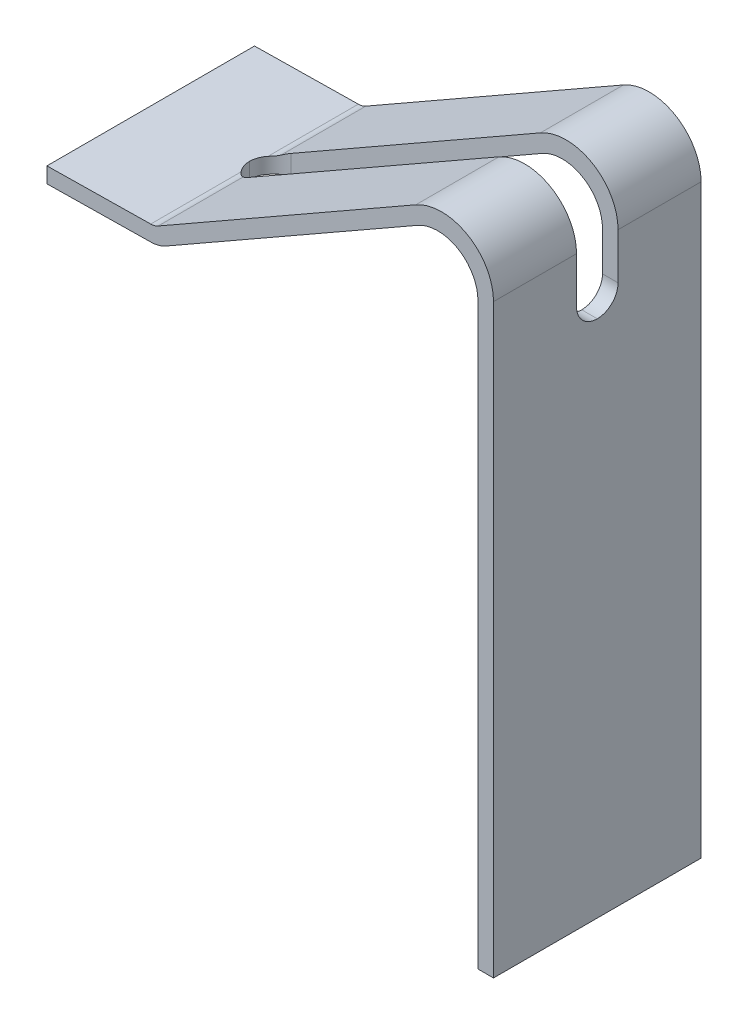
ISO-10303-21;
HEADER;
FILE_DESCRIPTION(('STEP AP214'),'2;1');
FILE_NAME('part.step','',(''),(''),'','','');
FILE_SCHEMA(('AUTOMOTIVE_DESIGN { 1 0 10303 214 1 1 1 1 }'));
ENDSEC;
DATA;
#1=APPLICATION_CONTEXT('core data for automotive mechanical design processes');
#2=APPLICATION_PROTOCOL_DEFINITION('international standard','automotive_design',2000,#1);
#3=PRODUCT_CONTEXT('',#1,'mechanical');
#4=PRODUCT('Part','Part','',(#3));
#5=PRODUCT_RELATED_PRODUCT_CATEGORY('part','',(#4));
#6=PRODUCT_DEFINITION_FORMATION('','',#4);
#7=PRODUCT_DEFINITION_CONTEXT('part definition',#1,'design');
#8=PRODUCT_DEFINITION('design','',#6,#7);
#9=PRODUCT_DEFINITION_SHAPE('','',#8);
#10=(LENGTH_UNIT() NAMED_UNIT(*) SI_UNIT(.MILLI.,.METRE.));
#11=(NAMED_UNIT(*) PLANE_ANGLE_UNIT() SI_UNIT($,.RADIAN.));
#12=(NAMED_UNIT(*) SI_UNIT($,.STERADIAN.) SOLID_ANGLE_UNIT());
#13=UNCERTAINTY_MEASURE_WITH_UNIT(LENGTH_MEASURE(1.E-05),#10,'distance_accuracy_value','');
#14=(GEOMETRIC_REPRESENTATION_CONTEXT(3) GLOBAL_UNCERTAINTY_ASSIGNED_CONTEXT((#13)) GLOBAL_UNIT_ASSIGNED_CONTEXT((#10,
#11,#12)) REPRESENTATION_CONTEXT('',''));
#15=CARTESIAN_POINT('',(0.,0.,0.));
#16=DIRECTION('',(0.,0.,1.));
#17=DIRECTION('',(1.,0.,0.));
#18=AXIS2_PLACEMENT_3D('',#15,#16,#17);
#19=CARTESIAN_POINT('',(1.07938838039175,10.209972433005,2.));
#20=DIRECTION('',(0.,0.,-1.));
#21=DIRECTION('',(-1.,0.,0.));
#22=AXIS2_PLACEMENT_3D('',#19,#20,#21);
#23=CYLINDRICAL_SURFACE('',#22,1.);
#24=CARTESIAN_POINT('',(1.07938838039175,10.209972433005,-0.4));
#25=DIRECTION('',(0.,0.,-1.));
#26=DIRECTION('',(-1.,0.,0.));
#27=AXIS2_PLACEMENT_3D('',#24,#25,#26);
#28=CIRCLE('',#27,1.);
#29=CARTESIAN_POINT('',(0.583337044187871,11.0782656276406,-0.4));
#30=VERTEX_POINT('',#29);
#31=CARTESIAN_POINT('',(2.07938838039175,10.209972433005,-0.4));
#32=VERTEX_POINT('',#31);
#33=EDGE_CURVE('E394',#30,#32,#28,.T.);
#34=ORIENTED_EDGE('',*,*,#33,.T.);
#35=DIRECTION('',(0.,0.,-1.));
#36=VECTOR('',#35,1.);
#37=CARTESIAN_POINT('',(2.07938838039175,10.209972433005,2.));
#38=LINE('',#37,#36);
#39=CARTESIAN_POINT('',(2.07938838039175,10.209972433005,-2.));
#40=VERTEX_POINT('',#39);
#41=EDGE_CURVE('E270',#32,#40,#38,.T.);
#42=ORIENTED_EDGE('',*,*,#41,.T.);
#43=CARTESIAN_POINT('',(1.07938838039175,10.209972433005,-2.));
#44=DIRECTION('',(0.,0.,1.));
#45=DIRECTION('',(1.,0.,0.));
#46=AXIS2_PLACEMENT_3D('',#43,#44,#45);
#47=CIRCLE('',#46,1.);
#48=CARTESIAN_POINT('',(0.583337044187871,11.0782656276406,-2.));
#49=VERTEX_POINT('',#48);
#50=EDGE_CURVE('E433',#40,#49,#47,.T.);
#51=ORIENTED_EDGE('',*,*,#50,.T.);
#52=DIRECTION('',(0.,0.,-1.));
#53=VECTOR('',#52,1.);
#54=CARTESIAN_POINT('',(0.583337044187871,11.0782656276406,2.));
#55=LINE('',#54,#53);
#56=EDGE_CURVE('E266',#30,#49,#55,.T.);
#57=ORIENTED_EDGE('',*,*,#56,.F.);
#58=EDGE_LOOP('',(#34,#42,#51,#57));
#59=FACE_BOUND('',#58,.T.);
#60=ADVANCED_FACE('F37',(#59),#23,.T.);
#61=CARTESIAN_POINT('',(1.00409281300757,10.0802397172688,2.));
#62=DIRECTION('',(0.,0.,-1.));
#63=DIRECTION('',(-1.,0.,0.));
#64=AXIS2_PLACEMENT_3D('',#61,#62,#63);
#65=CYLINDRICAL_SURFACE('',#64,0.775295567384185);
#66=DIRECTION('',(0.,0.,-1.));
#67=VECTOR('',#66,1.);
#68=CARTESIAN_POINT('',(1.77938838039175,10.0802397172688,2.));
#69=LINE('',#68,#67);
#70=CARTESIAN_POINT('',(1.77938838039175,10.0802397172688,-0.4));
#71=VERTEX_POINT('',#70);
#72=CARTESIAN_POINT('',(1.77938838039175,10.0802397172688,-2.));
#73=VERTEX_POINT('',#72);
#74=EDGE_CURVE('E234',#71,#73,#69,.T.);
#75=ORIENTED_EDGE('',*,*,#74,.F.);
#76=CARTESIAN_POINT('',(1.00409281300757,10.0802397172688,-0.4));
#77=DIRECTION('',(0.,0.,-1.));
#78=DIRECTION('',(-1.,0.,0.));
#79=AXIS2_PLACEMENT_3D('',#76,#77,#78);
#80=CIRCLE('',#79,0.775295567384185);
#81=CARTESIAN_POINT('',(0.619506410853697,10.7534235822596,-0.4));
#82=VERTEX_POINT('',#81);
#83=EDGE_CURVE('E219',#71,#82,#80,.F.);
#84=ORIENTED_EDGE('',*,*,#83,.T.);
#85=DIRECTION('',(0.,0.,-1.));
#86=VECTOR('',#85,1.);
#87=CARTESIAN_POINT('',(0.619506410853697,10.7534235822596,2.));
#88=LINE('',#87,#86);
#89=CARTESIAN_POINT('',(0.619506410853697,10.7534235822596,-2.));
#90=VERTEX_POINT('',#89);
#91=EDGE_CURVE('E232',#82,#90,#88,.T.);
#92=ORIENTED_EDGE('',*,*,#91,.T.);
#93=CARTESIAN_POINT('',(1.00409281300757,10.0802397172688,-2.));
#94=DIRECTION('',(0.,0.,-1.));
#95=DIRECTION('',(1.,0.,0.));
#96=AXIS2_PLACEMENT_3D('',#93,#94,#95);
#97=CIRCLE('',#96,0.775295567384185);
#98=EDGE_CURVE('E404',#90,#73,#97,.T.);
#99=ORIENTED_EDGE('',*,*,#98,.T.);
#100=EDGE_LOOP('',(#75,#84,#92,#99));
#101=FACE_BOUND('',#100,.T.);
#102=ADVANCED_FACE('F230',(#101),#65,.F.);
#103=CARTESIAN_POINT('',(2.07938838039175,10.209972433005,2.));
#104=VERTEX_POINT('',#103);
#105=CARTESIAN_POINT('',(2.07938838039175,10.209972433005,0.4));
#106=VERTEX_POINT('',#105);
#107=EDGE_CURVE('E271',#104,#106,#38,.T.);
#108=ORIENTED_EDGE('',*,*,#107,.T.);
#109=CARTESIAN_POINT('',(1.07938838039175,10.209972433005,0.4));
#110=DIRECTION('',(0.,0.,-1.));
#111=DIRECTION('',(-1.,0.,0.));
#112=AXIS2_PLACEMENT_3D('',#109,#110,#111);
#113=CIRCLE('',#112,1.);
#114=CARTESIAN_POINT('',(0.583337044187871,11.0782656276406,0.4));
#115=VERTEX_POINT('',#114);
#116=EDGE_CURVE('E385',#115,#106,#113,.T.);
#117=ORIENTED_EDGE('',*,*,#116,.F.);
#118=CARTESIAN_POINT('',(0.583337044187871,11.0782656276406,2.));
#119=VERTEX_POINT('',#118);
#120=EDGE_CURVE('E267',#119,#115,#55,.T.);
#121=ORIENTED_EDGE('',*,*,#120,.F.);
#122=CARTESIAN_POINT('',(1.07938838039175,10.209972433005,2.));
#123=DIRECTION('',(0.,0.,1.));
#124=DIRECTION('',(1.,0.,0.));
#125=AXIS2_PLACEMENT_3D('',#122,#123,#124);
#126=CIRCLE('',#125,1.);
#127=EDGE_CURVE('E408',#104,#119,#126,.T.);
#128=ORIENTED_EDGE('',*,*,#127,.F.);
#129=EDGE_LOOP('',(#108,#117,#121,#128));
#130=FACE_BOUND('',#129,.T.);
#131=ADVANCED_FACE('F507',(#130),#23,.T.);
#132=CARTESIAN_POINT('',(0.58333704418787,11.0782656276406,2.));
#133=DIRECTION('',(0.496051336203883,-0.868293194635512,0.));
#134=DIRECTION('',(0.868293194635512,0.496051336203883,0.));
#135=AXIS2_PLACEMENT_3D('',#132,#133,#134);
#136=PLANE('',#135);
#137=DIRECTION('',(0.868293194635512,0.496051336203883,0.));
#138=VECTOR('',#137,1.);
#139=CARTESIAN_POINT('',(0.58333704418787,11.0782656276406,0.4));
#140=LINE('',#139,#138);
#141=CARTESIAN_POINT('',(-4.22061161960825,8.33379501742088,0.4));
#142=VERTEX_POINT('',#141);
#143=EDGE_CURVE('E396',#142,#115,#140,.T.);
#144=ORIENTED_EDGE('',*,*,#143,.F.);
#145=CARTESIAN_POINT('',(-4.22061161960825,8.33379501742088,0.));
#146=DIRECTION('',(0.496051336203883,-0.868293194635512,0.));
#147=DIRECTION('',(-0.868293194635512,-0.496051336203883,0.));
#148=AXIS2_PLACEMENT_3D('',#145,#146,#147);
#149=ELLIPSE('',#148,0.460673885815621,0.4);
#150=CARTESIAN_POINT('',(-4.38061108192166,8.24238816595316,0.366606290262111));
#151=VERTEX_POINT('',#150);
#152=EDGE_CURVE('E487',#142,#151,#149,.T.);
#153=ORIENTED_EDGE('',*,*,#152,.T.);
#154=DIRECTION('',(0.,0.,-1.));
#155=VECTOR('',#154,1.);
#156=CARTESIAN_POINT('',(-4.38061108192166,8.24238816595316,2.));
#157=LINE('',#156,#155);
#158=CARTESIAN_POINT('',(-4.38061108192166,8.24238816595316,2.));
#159=VERTEX_POINT('',#158);
#160=EDGE_CURVE('E264',#159,#151,#157,.T.);
#161=ORIENTED_EDGE('',*,*,#160,.F.);
#162=DIRECTION('',(-0.868293194635512,-0.496051336203883,0.));
#163=VECTOR('',#162,1.);
#164=CARTESIAN_POINT('',(0.58333704418787,11.0782656276406,2.));
#165=LINE('',#164,#163);
#166=EDGE_CURVE('E410',#119,#159,#165,.T.);
#167=ORIENTED_EDGE('',*,*,#166,.F.);
#168=ORIENTED_EDGE('',*,*,#120,.T.);
#169=EDGE_LOOP('',(#144,#153,#161,#167,#168));
#170=FACE_BOUND('',#169,.T.);
#171=ADVANCED_FACE('F502',(#170),#136,.F.);
#172=CARTESIAN_POINT('',(-4.52942648278283,8.50287612434381,2.));
#173=DIRECTION('',(0.,0.,-1.));
#174=DIRECTION('',(-1.,0.,0.));
#175=AXIS2_PLACEMENT_3D('',#172,#173,#174);
#176=CYLINDRICAL_SURFACE('',#175,0.299999999999998);
#177=ORIENTED_EDGE('',*,*,#160,.T.);
#178=CARTESIAN_POINT('',(-4.38061108192166,8.24238816595316,0.36660629026211));
#179=CARTESIAN_POINT('',(-4.39365838327271,8.23490580670511,0.360949740759069));
#180=CARTESIAN_POINT('',(-4.40692409467293,8.22865495489743,0.354296055724142));
#181=CARTESIAN_POINT('',(-4.43290879822453,8.21850032744044,0.339325512590039));
#182=CARTESIAN_POINT('',(-4.44563300225809,8.21453926724607,0.331056878673564));
#183=CARTESIAN_POINT('',(-4.46997033388543,8.20856423423468,0.313119815062712));
#184=CARTESIAN_POINT('',(-4.48160411765151,8.20650085016347,0.30349491772136));
#185=CARTESIAN_POINT('',(-4.50409665741563,8.20372739943339,0.282631798761902));
#186=CARTESIAN_POINT('',(-4.51492707746383,8.20305425285609,0.271357879478832));
#187=CARTESIAN_POINT('',(-4.52501905119554,8.20290850184631,0.25949203377836));
#188=B_SPLINE_CURVE_WITH_KNOTS('',3,(#178,#179,#180,#181,#182,#183,#184,#185,#186,#187),
.UNSPECIFIED.,.F.,.F.,(4,2,2,2,4),(0.,0.0480698623126395,0.0948783425544005,0.140430350415653,
0.187177278791692),.UNSPECIFIED.);
#189=CARTESIAN_POINT('',(-4.52501905119554,8.20290850184631,0.25949203377836));
#190=VERTEX_POINT('',#189);
#191=EDGE_CURVE('E481',#151,#190,#188,.T.);
#192=ORIENTED_EDGE('',*,*,#191,.T.);
#193=DIRECTION('',(0.,0.,-1.));
#194=VECTOR('',#193,1.);
#195=CARTESIAN_POINT('',(-4.52501905119554,8.20290850184631,2.));
#196=LINE('',#195,#194);
#197=CARTESIAN_POINT('',(-4.52501905119554,8.20290850184631,2.));
#198=VERTEX_POINT('',#197);
#199=EDGE_CURVE('E261',#198,#190,#196,.T.);
#200=ORIENTED_EDGE('',*,*,#199,.F.);
#201=CARTESIAN_POINT('',(-4.52942648278283,8.50287612434381,2.));
#202=DIRECTION('',(0.,0.,-1.));
#203=DIRECTION('',(1.,0.,0.));
#204=AXIS2_PLACEMENT_3D('',#201,#202,#203);
#205=CIRCLE('',#204,0.299999999999998);
#206=EDGE_CURVE('E412',#159,#198,#205,.T.);
#207=ORIENTED_EDGE('',*,*,#206,.F.);
#208=EDGE_LOOP('',(#177,#192,#200,#207));
#209=FACE_BOUND('',#208,.T.);
#210=ADVANCED_FACE('F498',(#209),#176,.F.);
#211=CARTESIAN_POINT('',(-6.52501905119554,8.17352245310816,2.));
#212=DIRECTION('',(0.014691438624301,-0.99989207499167,0.));
#213=DIRECTION('',(0.999892074991671,0.014691438624301,0.));
#214=AXIS2_PLACEMENT_3D('',#211,#212,#213);
#215=PLANE('',#214);
#216=ORIENTED_EDGE('',*,*,#199,.T.);
#217=CARTESIAN_POINT('',(-4.22061161960825,8.20738116765676,0.));
#218=DIRECTION('',(0.014691438624301,-0.99989207499167,0.));
#219=DIRECTION('',(-0.999892074991671,-0.014691438624301,0.));
#220=AXIS2_PLACEMENT_3D('',#217,#218,#219);
#221=ELLIPSE('',#220,0.400043174662958,0.4);
#222=CARTESIAN_POINT('',(-4.62061161960825,8.20150395790912,0.));
#223=VERTEX_POINT('',#222);
#224=EDGE_CURVE('E475',#190,#223,#221,.T.);
#225=ORIENTED_EDGE('',*,*,#224,.T.);
#226=CARTESIAN_POINT('',(-4.22061161960825,8.20738116765676,0.));
#227=DIRECTION('',(0.014691438624301,-0.99989207499167,0.));
#228=DIRECTION('',(0.999892074991671,0.014691438624301,0.));
#229=AXIS2_PLACEMENT_3D('',#226,#227,#228);
#230=ELLIPSE('',#229,0.400043174662958,0.4);
#231=CARTESIAN_POINT('',(-4.52501905119554,8.20290850184631,-0.25949203377836));
#232=VERTEX_POINT('',#231);
#233=EDGE_CURVE('E288',#223,#232,#230,.T.);
#234=ORIENTED_EDGE('',*,*,#233,.T.);
#235=CARTESIAN_POINT('',(-4.52501905119554,8.20290850184631,-2.));
#236=VERTEX_POINT('',#235);
#237=EDGE_CURVE('E260',#232,#236,#196,.T.);
#238=ORIENTED_EDGE('',*,*,#237,.T.);
#239=DIRECTION('',(-0.999892074991671,-0.014691438624301,0.));
#240=VECTOR('',#239,1.);
#241=CARTESIAN_POINT('',(-6.52501905119554,8.17352245310816,-2.));
#242=LINE('',#241,#240);
#243=CARTESIAN_POINT('',(-6.52501905119554,8.17352245310816,-2.));
#244=VERTEX_POINT('',#243);
#245=EDGE_CURVE('E442',#236,#244,#242,.T.);
#246=ORIENTED_EDGE('',*,*,#245,.T.);
#247=DIRECTION('',(0.,0.,-1.));
#248=VECTOR('',#247,1.);
#249=CARTESIAN_POINT('',(-6.52501905119554,8.17352245310816,2.));
#250=LINE('',#249,#248);
#251=CARTESIAN_POINT('',(-6.52501905119554,8.17352245310816,2.));
#252=VERTEX_POINT('',#251);
#253=EDGE_CURVE('E257',#252,#244,#250,.T.);
#254=ORIENTED_EDGE('',*,*,#253,.F.);
#255=DIRECTION('',(-0.999892074991671,-0.014691438624301,0.));
#256=VECTOR('',#255,1.);
#257=CARTESIAN_POINT('',(-6.52501905119554,8.17352245310816,2.));
#258=LINE('',#257,#256);
#259=EDGE_CURVE('E414',#198,#252,#258,.T.);
#260=ORIENTED_EDGE('',*,*,#259,.F.);
#261=EDGE_LOOP('',(#216,#225,#234,#238,#246,#254,#260));
#262=FACE_BOUND('',#261,.T.);
#263=ADVANCED_FACE('F473',(#262),#215,.F.);
#264=CARTESIAN_POINT('',(-4.52061161960825,7.90294087934881,2.));
#265=DIRECTION('',(-0.0146914386243002,0.99989207499167,0.));
#266=DIRECTION('',(-0.999892074991671,-0.0146914386243002,0.));
#267=AXIS2_PLACEMENT_3D('',#264,#265,#266);
#268=PLANE('',#267);
#269=CARTESIAN_POINT('',(-4.22061161960825,7.90734878665953,0.));
#270=DIRECTION('',(-0.0146914386243002,0.99989207499167,0.));
#271=DIRECTION('',(0.999892074991671,0.0146914386243002,0.));
#272=AXIS2_PLACEMENT_3D('',#269,#270,#271);
#273=ELLIPSE('',#272,0.400043174662958,0.4);
#274=CARTESIAN_POINT('',(-4.52061161960825,7.90294087934881,-0.264575131106459));
#275=VERTEX_POINT('',#274);
#276=CARTESIAN_POINT('',(-4.62061161960825,7.9014715769119,0.));
#277=VERTEX_POINT('',#276);
#278=EDGE_CURVE('E324',#275,#277,#273,.T.);
#279=ORIENTED_EDGE('',*,*,#278,.T.);
#280=CARTESIAN_POINT('',(-4.22061161960825,7.90734878665953,0.));
#281=DIRECTION('',(-0.0146914386243002,0.99989207499167,0.));
#282=DIRECTION('',(-0.999892074991671,-0.0146914386243002,0.));
#283=AXIS2_PLACEMENT_3D('',#280,#281,#282);
#284=ELLIPSE('',#283,0.400043174662958,0.4);
#285=CARTESIAN_POINT('',(-4.52061161960825,7.90294087934881,0.264575131106459));
#286=VERTEX_POINT('',#285);
#287=EDGE_CURVE('E347',#277,#286,#284,.T.);
#288=ORIENTED_EDGE('',*,*,#287,.T.);
#289=DIRECTION('',(0.,0.,-1.));
#290=VECTOR('',#289,1.);
#291=CARTESIAN_POINT('',(-4.52061161960825,7.90294087934881,2.));
#292=LINE('',#291,#290);
#293=CARTESIAN_POINT('',(-4.52061161960825,7.90294087934881,2.));
#294=VERTEX_POINT('',#293);
#295=EDGE_CURVE('E61',#294,#286,#292,.T.);
#296=ORIENTED_EDGE('',*,*,#295,.F.);
#297=DIRECTION('',(0.999892074991671,0.0146914386243002,0.));
#298=VECTOR('',#297,1.);
#299=CARTESIAN_POINT('',(-4.52061161960825,7.90294087934881,2.));
#300=LINE('',#299,#298);
#301=CARTESIAN_POINT('',(-6.52061161960825,7.87355483061066,2.));
#302=VERTEX_POINT('',#301);
#303=EDGE_CURVE('E418',#302,#294,#300,.T.);
#304=ORIENTED_EDGE('',*,*,#303,.F.);
#305=DIRECTION('',(0.,0.,-1.));
#306=VECTOR('',#305,1.);
#307=CARTESIAN_POINT('',(-6.52061161960825,7.87355483061066,2.));
#308=LINE('',#307,#306);
#309=CARTESIAN_POINT('',(-6.52061161960825,7.87355483061066,-2.));
#310=VERTEX_POINT('',#309);
#311=EDGE_CURVE('E254',#302,#310,#308,.T.);
#312=ORIENTED_EDGE('',*,*,#311,.T.);
#313=DIRECTION('',(0.999892074991671,0.0146914386243002,0.));
#314=VECTOR('',#313,1.);
#315=CARTESIAN_POINT('',(-4.52061161960825,7.90294087934881,-2.));
#316=LINE('',#315,#314);
#317=CARTESIAN_POINT('',(-4.52061161960825,7.90294087934881,-2.));
#318=VERTEX_POINT('',#317);
#319=EDGE_CURVE('E446',#310,#318,#316,.T.);
#320=ORIENTED_EDGE('',*,*,#319,.T.);
#321=EDGE_CURVE('E252',#275,#318,#292,.T.);
#322=ORIENTED_EDGE('',*,*,#321,.F.);
#323=EDGE_LOOP('',(#279,#288,#296,#304,#312,#320,#322));
#324=FACE_BOUND('',#323,.T.);
#325=ADVANCED_FACE('F336',(#324),#268,.F.);
#326=CARTESIAN_POINT('',(-4.52942648278283,8.50287612434382,2.));
#327=DIRECTION('',(0.,0.,-1.));
#328=DIRECTION('',(-1.,0.,0.));
#329=AXIS2_PLACEMENT_3D('',#326,#327,#328);
#330=CYLINDRICAL_SURFACE('',#329,0.600000000000002);
#331=ORIENTED_EDGE('',*,*,#295,.T.);
#332=CARTESIAN_POINT('',(-4.52061161960825,7.90294087934881,0.264575131106459));
#333=CARTESIAN_POINT('',(-4.50724401017289,7.90312587130588,0.279774268988246));
#334=CARTESIAN_POINT('',(-4.49267386747487,7.90379737028348,0.293932895122339));
#335=CARTESIAN_POINT('',(-4.461677026405,7.90651381756933,0.319826040420823));
#336=CARTESIAN_POINT('',(-4.44525347520852,7.9085564659452,0.331564575957396));
#337=CARTESIAN_POINT('',(-4.41098982788124,7.91442389896125,0.352364046113291));
#338=CARTESIAN_POINT('',(-4.39314494363604,7.91825493871002,0.361415398736344));
#339=CARTESIAN_POINT('',(-4.3567905930127,7.92794135067373,0.376620317173052));
#340=CARTESIAN_POINT('',(-4.3382814709275,7.93379568735995,0.382775361526815));
#341=CARTESIAN_POINT('',(-4.30488695471764,7.94624752657733,0.391325025360888));
#342=CARTESIAN_POINT('',(-4.28998951791501,7.95248533270155,0.394215303176958));
#343=CARTESIAN_POINT('',(-4.26054736511084,7.96624586564557,0.398281087322699));
#344=CARTESIAN_POINT('',(-4.24600281740065,7.97376919228548,0.399455790716472));
#345=CARTESIAN_POINT('',(-4.2317956810605,7.98190020756251,0.399843615391608));
#346=B_SPLINE_CURVE_WITH_KNOTS('',3,(#332,#333,#334,#335,#336,#337,#338,#339,#340,#341,#342,
#343,#344,#345),.UNSPECIFIED.,.F.,.F.,(4,2,2,2,2,2,4),(0.,0.0606903021900377,0.121279057497597,
0.182081335365354,0.242852540436971,0.291931429185142,0.341033280846589),.UNSPECIFIED.);
#347=CARTESIAN_POINT('',(-4.2317956810605,7.98190020756251,0.399843615391608));
#348=VERTEX_POINT('',#347);
#349=EDGE_CURVE('E340',#286,#348,#346,.T.);
#350=ORIENTED_EDGE('',*,*,#349,.T.);
#351=DIRECTION('',(0.,0.,-1.));
#352=VECTOR('',#351,1.);
#353=CARTESIAN_POINT('',(-4.2317956810605,7.98190020756251,2.));
#354=LINE('',#353,#352);
#355=CARTESIAN_POINT('',(-4.2317956810605,7.98190020756251,2.));
#356=VERTEX_POINT('',#355);
#357=EDGE_CURVE('E54',#356,#348,#354,.T.);
#358=ORIENTED_EDGE('',*,*,#357,.F.);
#359=CARTESIAN_POINT('',(-4.52942648278283,8.50287612434382,2.));
#360=DIRECTION('',(0.,0.,1.));
#361=DIRECTION('',(1.,0.,0.));
#362=AXIS2_PLACEMENT_3D('',#359,#360,#361);
#363=CIRCLE('',#362,0.600000000000002);
#364=EDGE_CURVE('E420',#294,#356,#363,.T.);
#365=ORIENTED_EDGE('',*,*,#364,.F.);
#366=EDGE_LOOP('',(#331,#350,#358,#365));
#367=FACE_BOUND('',#366,.T.);
#368=ADVANCED_FACE('F334',(#367),#330,.T.);
#369=CARTESIAN_POINT('',(0.619506410853697,10.7534235822596,2.));
#370=DIRECTION('',(-0.496051336203883,0.868293194635511,0.));
#371=DIRECTION('',(-0.868293194635511,-0.496051336203883,0.));
#372=AXIS2_PLACEMENT_3D('',#369,#370,#371);
#373=PLANE('',#372);
#374=ORIENTED_EDGE('',*,*,#357,.T.);
#375=CARTESIAN_POINT('',(-4.22061161960825,7.98828960305916,0.));
#376=DIRECTION('',(-0.496051336203883,0.868293194635511,0.));
#377=DIRECTION('',(-0.868293194635511,-0.496051336203883,0.));
#378=AXIS2_PLACEMENT_3D('',#375,#376,#377);
#379=ELLIPSE('',#378,0.460673885815621,0.4);
#380=CARTESIAN_POINT('',(-4.22061161960825,7.98828960305916,0.4));
#381=VERTEX_POINT('',#380);
#382=EDGE_CURVE('E346',#348,#381,#379,.T.);
#383=ORIENTED_EDGE('',*,*,#382,.T.);
#384=DIRECTION('',(0.868293194635511,0.496051336203883,0.));
#385=VECTOR('',#384,1.);
#386=CARTESIAN_POINT('',(-3.43938625113844,8.43459954801789,0.4));
#387=LINE('',#386,#385);
#388=CARTESIAN_POINT('',(0.619506410853697,10.7534235822596,0.4));
#389=VERTEX_POINT('',#388);
#390=EDGE_CURVE('E227',#381,#389,#387,.T.);
#391=ORIENTED_EDGE('',*,*,#390,.T.);
#392=CARTESIAN_POINT('',(0.619506410853697,10.7534235822596,2.));
#393=VERTEX_POINT('',#392);
#394=EDGE_CURVE('E242',#393,#389,#88,.T.);
#395=ORIENTED_EDGE('',*,*,#394,.F.);
#396=DIRECTION('',(0.868293194635511,0.496051336203883,0.));
#397=VECTOR('',#396,1.);
#398=CARTESIAN_POINT('',(0.619506410853697,10.7534235822596,2.));
#399=LINE('',#398,#397);
#400=EDGE_CURVE('E422',#356,#393,#399,.T.);
#401=ORIENTED_EDGE('',*,*,#400,.F.);
#402=EDGE_LOOP('',(#374,#383,#391,#395,#401));
#403=FACE_BOUND('',#402,.T.);
#404=ADVANCED_FACE('F520',(#403),#373,.F.);
#405=CARTESIAN_POINT('',(1.77938838039175,-1.07588472414067,2.));
#406=DIRECTION('',(1.,0.,0.));
#407=DIRECTION('',(0.,1.,0.));
#408=AXIS2_PLACEMENT_3D('',#405,#406,#407);
#409=PLANE('',#408);
#410=DIRECTION('',(0.,-1.,0.));
#411=VECTOR('',#410,1.);
#412=CARTESIAN_POINT('',(1.77938838039175,-1.07588472414067,0.4));
#413=LINE('',#412,#411);
#414=CARTESIAN_POINT('',(1.77938838039175,10.0802397172688,0.4));
#415=VERTEX_POINT('',#414);
#416=CARTESIAN_POINT('',(1.77938838039175,9.32411527585933,0.4));
#417=VERTEX_POINT('',#416);
#418=EDGE_CURVE('E361',#415,#417,#413,.T.);
#419=ORIENTED_EDGE('',*,*,#418,.T.);
#420=CARTESIAN_POINT('',(1.77938838039175,9.32411527585933,0.));
#421=DIRECTION('',(1.,0.,0.));
#422=DIRECTION('',(0.,1.,0.));
#423=AXIS2_PLACEMENT_3D('',#420,#421,#422);
#424=CIRCLE('',#423,0.4);
#425=CARTESIAN_POINT('',(1.77938838039175,8.92411527585933,0.));
#426=VERTEX_POINT('',#425);
#427=EDGE_CURVE('E46',#417,#426,#424,.T.);
#428=ORIENTED_EDGE('',*,*,#427,.T.);
#429=CARTESIAN_POINT('',(1.77938838039175,9.32411527585933,0.));
#430=DIRECTION('',(1.,0.,0.));
#431=DIRECTION('',(0.,1.,0.));
#432=AXIS2_PLACEMENT_3D('',#429,#430,#431);
#433=CIRCLE('',#432,0.4);
#434=CARTESIAN_POINT('',(1.77938838039175,9.32411527585933,-0.4));
#435=VERTEX_POINT('',#434);
#436=EDGE_CURVE('E352',#426,#435,#433,.T.);
#437=ORIENTED_EDGE('',*,*,#436,.T.);
#438=DIRECTION('',(0.,1.,0.));
#439=VECTOR('',#438,1.);
#440=CARTESIAN_POINT('',(1.77938838039175,-1.07588472414067,-0.4));
#441=LINE('',#440,#439);
#442=EDGE_CURVE('E235',#435,#71,#441,.T.);
#443=ORIENTED_EDGE('',*,*,#442,.T.);
#444=ORIENTED_EDGE('',*,*,#74,.T.);
#445=DIRECTION('',(0.,-1.,0.));
#446=VECTOR('',#445,1.);
#447=CARTESIAN_POINT('',(1.77938838039175,-1.07588472414067,-2.));
#448=LINE('',#447,#446);
#449=CARTESIAN_POINT('',(1.77938838039175,-1.07588472414067,-2.));
#450=VERTEX_POINT('',#449);
#451=EDGE_CURVE('E399',#73,#450,#448,.T.);
#452=ORIENTED_EDGE('',*,*,#451,.T.);
#453=DIRECTION('',(0.,0.,-1.));
#454=VECTOR('',#453,1.);
#455=CARTESIAN_POINT('',(1.77938838039175,-1.07588472414067,2.));
#456=LINE('',#455,#454);
#457=CARTESIAN_POINT('',(1.77938838039175,-1.07588472414067,2.));
#458=VERTEX_POINT('',#457);
#459=EDGE_CURVE('E277',#458,#450,#456,.T.);
#460=ORIENTED_EDGE('',*,*,#459,.F.);
#461=DIRECTION('',(0.,-1.,0.));
#462=VECTOR('',#461,1.);
#463=CARTESIAN_POINT('',(1.77938838039175,-1.07588472414067,2.));
#464=LINE('',#463,#462);
#465=CARTESIAN_POINT('',(1.77938838039175,10.0802397172688,2.));
#466=VERTEX_POINT('',#465);
#467=EDGE_CURVE('E400',#466,#458,#464,.T.);
#468=ORIENTED_EDGE('',*,*,#467,.F.);
#469=EDGE_CURVE('E243',#466,#415,#69,.T.);
#470=ORIENTED_EDGE('',*,*,#469,.T.);
#471=EDGE_LOOP('',(#419,#428,#437,#443,#444,#452,#460,#468,#470));
#472=FACE_BOUND('',#471,.T.);
#473=ADVANCED_FACE('F312',(#472),#409,.F.);
#474=CARTESIAN_POINT('',(1.77938838039175,-1.07588472414067,2.));
#475=DIRECTION('',(0.,1.,0.));
#476=DIRECTION('',(0.,0.,1.));
#477=AXIS2_PLACEMENT_3D('',#474,#475,#476);
#478=PLANE('',#477);
#479=DIRECTION('',(1.,0.,0.));
#480=VECTOR('',#479,1.);
#481=CARTESIAN_POINT('',(1.77938838039175,-1.07588472414067,-2.));
#482=LINE('',#481,#480);
#483=CARTESIAN_POINT('',(2.07938838039175,-1.07588472414067,-2.));
#484=VERTEX_POINT('',#483);
#485=EDGE_CURVE('E428',#450,#484,#482,.T.);
#486=ORIENTED_EDGE('',*,*,#485,.T.);
#487=DIRECTION('',(0.,0.,-1.));
#488=VECTOR('',#487,1.);
#489=CARTESIAN_POINT('',(2.07938838039175,-1.07588472414067,2.));
#490=LINE('',#489,#488);
#491=CARTESIAN_POINT('',(2.07938838039175,-1.07588472414067,2.));
#492=VERTEX_POINT('',#491);
#493=EDGE_CURVE('E274',#492,#484,#490,.T.);
#494=ORIENTED_EDGE('',*,*,#493,.F.);
#495=DIRECTION('',(1.,0.,0.));
#496=VECTOR('',#495,1.);
#497=CARTESIAN_POINT('',(1.77938838039175,-1.07588472414067,2.));
#498=LINE('',#497,#496);
#499=EDGE_CURVE('E403',#458,#492,#498,.T.);
#500=ORIENTED_EDGE('',*,*,#499,.F.);
#501=ORIENTED_EDGE('',*,*,#459,.T.);
#502=EDGE_LOOP('',(#486,#494,#500,#501));
#503=FACE_BOUND('',#502,.T.);
#504=ADVANCED_FACE('F513',(#503),#478,.F.);
#505=CARTESIAN_POINT('',(2.07938838039175,-1.07588472414067,2.));
#506=DIRECTION('',(-1.,0.,0.));
#507=DIRECTION('',(0.,-1.,0.));
#508=AXIS2_PLACEMENT_3D('',#505,#506,#507);
#509=PLANE('',#508);
#510=ORIENTED_EDGE('',*,*,#41,.F.);
#511=DIRECTION('',(0.,-1.,0.));
#512=VECTOR('',#511,1.);
#513=CARTESIAN_POINT('',(2.07938838039175,-1.07588472414067,-0.4));
#514=LINE('',#513,#512);
#515=CARTESIAN_POINT('',(2.07938838039175,9.32411527585933,-0.4));
#516=VERTEX_POINT('',#515);
#517=EDGE_CURVE('E390',#32,#516,#514,.T.);
#518=ORIENTED_EDGE('',*,*,#517,.T.);
#519=CARTESIAN_POINT('',(2.07938838039175,9.32411527585933,0.));
#520=DIRECTION('',(-1.,0.,0.));
#521=DIRECTION('',(0.,-1.,0.));
#522=AXIS2_PLACEMENT_3D('',#519,#520,#521);
#523=CIRCLE('',#522,0.4);
#524=CARTESIAN_POINT('',(2.07938838039175,8.92411527585933,0.));
#525=VERTEX_POINT('',#524);
#526=EDGE_CURVE('E350',#516,#525,#523,.T.);
#527=ORIENTED_EDGE('',*,*,#526,.T.);
#528=CARTESIAN_POINT('',(2.07938838039175,9.32411527585933,0.));
#529=DIRECTION('',(-1.,0.,0.));
#530=DIRECTION('',(0.,-1.,0.));
#531=AXIS2_PLACEMENT_3D('',#528,#529,#530);
#532=CIRCLE('',#531,0.4);
#533=CARTESIAN_POINT('',(2.07938838039175,9.32411527585933,0.4));
#534=VERTEX_POINT('',#533);
#535=EDGE_CURVE('E12',#525,#534,#532,.T.);
#536=ORIENTED_EDGE('',*,*,#535,.T.);
#537=DIRECTION('',(0.,1.,0.));
#538=VECTOR('',#537,1.);
#539=CARTESIAN_POINT('',(2.07938838039175,-1.07588472414067,0.4));
#540=LINE('',#539,#538);
#541=EDGE_CURVE('E236',#534,#106,#540,.T.);
#542=ORIENTED_EDGE('',*,*,#541,.T.);
#543=ORIENTED_EDGE('',*,*,#107,.F.);
#544=DIRECTION('',(0.,1.,0.));
#545=VECTOR('',#544,1.);
#546=CARTESIAN_POINT('',(2.07938838039175,-1.07588472414067,2.));
#547=LINE('',#546,#545);
#548=EDGE_CURVE('E406',#492,#104,#547,.T.);
#549=ORIENTED_EDGE('',*,*,#548,.F.);
#550=ORIENTED_EDGE('',*,*,#493,.T.);
#551=DIRECTION('',(0.,1.,0.));
#552=VECTOR('',#551,1.);
#553=CARTESIAN_POINT('',(2.07938838039175,-1.07588472414067,-2.));
#554=LINE('',#553,#552);
#555=EDGE_CURVE('E430',#484,#40,#554,.T.);
#556=ORIENTED_EDGE('',*,*,#555,.T.);
#557=EDGE_LOOP('',(#510,#518,#527,#536,#542,#543,#549,#550,#556));
#558=FACE_BOUND('',#557,.T.);
#559=ADVANCED_FACE('F376',(#558),#509,.F.);
#560=CARTESIAN_POINT('',(-4.38061108192166,8.24238816595316,-0.366606290262111));
#561=VERTEX_POINT('',#560);
#562=CARTESIAN_POINT('',(-4.38061108192166,8.24238816595316,-2.));
#563=VERTEX_POINT('',#562);
#564=EDGE_CURVE('E263',#561,#563,#157,.T.);
#565=ORIENTED_EDGE('',*,*,#564,.F.);
#566=CARTESIAN_POINT('',(-4.22061161960825,8.33379501742088,0.));
#567=DIRECTION('',(0.496051336203883,-0.868293194635512,0.));
#568=DIRECTION('',(0.868293194635512,0.496051336203883,0.));
#569=AXIS2_PLACEMENT_3D('',#566,#567,#568);
#570=ELLIPSE('',#569,0.460673885815621,0.4);
#571=CARTESIAN_POINT('',(-4.22061161960825,8.33379501742088,-0.4));
#572=VERTEX_POINT('',#571);
#573=EDGE_CURVE('E299',#561,#572,#570,.T.);
#574=ORIENTED_EDGE('',*,*,#573,.T.);
#575=DIRECTION('',(0.868293194635512,0.496051336203883,0.));
#576=VECTOR('',#575,1.);
#577=CARTESIAN_POINT('',(0.58333704418787,11.0782656276406,-0.4));
#578=LINE('',#577,#576);
#579=EDGE_CURVE('E226',#572,#30,#578,.T.);
#580=ORIENTED_EDGE('',*,*,#579,.T.);
#581=ORIENTED_EDGE('',*,*,#56,.T.);
#582=DIRECTION('',(-0.868293194635512,-0.496051336203883,0.));
#583=VECTOR('',#582,1.);
#584=CARTESIAN_POINT('',(0.58333704418787,11.0782656276406,-2.));
#585=LINE('',#584,#583);
#586=EDGE_CURVE('E436',#49,#563,#585,.T.);
#587=ORIENTED_EDGE('',*,*,#586,.T.);
#588=EDGE_LOOP('',(#565,#574,#580,#581,#587));
#589=FACE_BOUND('',#588,.T.);
#590=ADVANCED_FACE('F469',(#589),#136,.F.);
#591=ORIENTED_EDGE('',*,*,#237,.F.);
#592=CARTESIAN_POINT('',(-4.52501905119554,8.20290850184631,-0.25949203377836));
#593=CARTESIAN_POINT('',(-4.51410351686689,8.20306105775775,-0.272340747320112));
#594=CARTESIAN_POINT('',(-4.50230468675011,8.20384005338817,-0.284494840582222));
#595=CARTESIAN_POINT('',(-4.47777048493706,8.20710616134359,-0.306808061291965));
#596=CARTESIAN_POINT('',(-4.46507031173621,8.20954513757058,-0.317013292076783));
#597=CARTESIAN_POINT('',(-4.4405134183643,8.21611086342353,-0.334426105004253));
#598=CARTESIAN_POINT('',(-4.42874541782399,8.21999279343513,-0.341848071817193));
#599=CARTESIAN_POINT('',(-4.40479377314781,8.22967136929165,-0.35535242955513));
#600=CARTESIAN_POINT('',(-4.39260709831608,8.23551351042872,-0.361396639049973));
#601=CARTESIAN_POINT('',(-4.38061108192144,8.24238816595329,-0.366606290261757));
#602=B_SPLINE_CURVE_WITH_KNOTS('',3,(#592,#593,#594,#595,#596,#597,#598,#599,#600,#601),
.UNSPECIFIED.,.F.,.F.,(4,2,2,2,4),(0.,0.0506107843394847,0.0998131898531315,0.14295672771925,
0.187180198179944),.UNSPECIFIED.);
#603=EDGE_CURVE('E291',#232,#561,#602,.T.);
#604=ORIENTED_EDGE('',*,*,#603,.T.);
#605=ORIENTED_EDGE('',*,*,#564,.T.);
#606=CARTESIAN_POINT('',(-4.52942648278283,8.50287612434381,-2.));
#607=DIRECTION('',(0.,0.,-1.));
#608=DIRECTION('',(1.,0.,0.));
#609=AXIS2_PLACEMENT_3D('',#606,#607,#608);
#610=CIRCLE('',#609,0.299999999999998);
#611=EDGE_CURVE('E439',#563,#236,#610,.T.);
#612=ORIENTED_EDGE('',*,*,#611,.T.);
#613=EDGE_LOOP('',(#591,#604,#605,#612));
#614=FACE_BOUND('',#613,.T.);
#615=ADVANCED_FACE('F301',(#614),#176,.F.);
#616=CARTESIAN_POINT('',(-6.52061161960825,7.87355483061066,2.));
#617=DIRECTION('',(0.99989207499167,0.0146914386242996,0.));
#618=DIRECTION('',(-0.0146914386242996,0.999892074991671,0.));
#619=AXIS2_PLACEMENT_3D('',#616,#617,#618);
#620=PLANE('',#619);
#621=DIRECTION('',(0.0146914386242996,-0.999892074991671,0.));
#622=VECTOR('',#621,1.);
#623=CARTESIAN_POINT('',(-6.52061161960825,7.87355483061066,-2.));
#624=LINE('',#623,#622);
#625=EDGE_CURVE('E444',#244,#310,#624,.T.);
#626=ORIENTED_EDGE('',*,*,#625,.T.);
#627=ORIENTED_EDGE('',*,*,#311,.F.);
#628=DIRECTION('',(0.0146914386242996,-0.999892074991671,0.));
#629=VECTOR('',#628,1.);
#630=CARTESIAN_POINT('',(-6.52061161960825,7.87355483061066,2.));
#631=LINE('',#630,#629);
#632=EDGE_CURVE('E416',#252,#302,#631,.T.);
#633=ORIENTED_EDGE('',*,*,#632,.F.);
#634=ORIENTED_EDGE('',*,*,#253,.T.);
#635=EDGE_LOOP('',(#626,#627,#633,#634));
#636=FACE_BOUND('',#635,.T.);
#637=ADVANCED_FACE('F332',(#636),#620,.F.);
#638=CARTESIAN_POINT('',(-4.2317956810605,7.98190020756251,-0.399843615391608));
#639=VERTEX_POINT('',#638);
#640=CARTESIAN_POINT('',(-4.2317956810605,7.98190020756251,-2.));
#641=VERTEX_POINT('',#640);
#642=EDGE_CURVE('E246',#639,#641,#354,.T.);
#643=ORIENTED_EDGE('',*,*,#642,.F.);
#644=CARTESIAN_POINT('',(-4.2317956810605,7.98190020756251,-0.399843615391608));
#645=CARTESIAN_POINT('',(-4.24930913428991,7.97185640178489,-0.399382656763358));
#646=CARTESIAN_POINT('',(-4.26736040018383,7.96275422536114,-0.397697426519877));
#647=CARTESIAN_POINT('',(-4.30385327794033,7.94654557180844,-0.391671001721523));
#648=CARTESIAN_POINT('',(-4.32229386434937,7.93943442034161,-0.387336105341976));
#649=CARTESIAN_POINT('',(-4.35903991385515,7.92724834399985,-0.375780492686255));
#650=CARTESIAN_POINT('',(-4.3773445803359,7.92218138704269,-0.368548698828386));
#651=CARTESIAN_POINT('',(-4.4130172697813,7.9139929373265,-0.351244487093006));
#652=CARTESIAN_POINT('',(-4.43038546072449,7.91087109459868,-0.341172580688103));
#653=CARTESIAN_POINT('',(-4.46045587738048,7.90669707376582,-0.320535354390268));
#654=CARTESIAN_POINT('',(-4.47342565729922,7.90536822310807,-0.310408944011658));
#655=CARTESIAN_POINT('',(-4.49806035217063,7.90356866178688,-0.288608079580743));
#656=CARTESIAN_POINT('',(-4.50972524278162,7.90309796712916,-0.276933596659252));
#657=CARTESIAN_POINT('',(-4.52061161960825,7.90294087934881,-0.26457513110646));
#658=B_SPLINE_CURVE_WITH_KNOTS('',3,(#644,#645,#646,#647,#648,#649,#650,#651,#652,#653,#654,
#655,#656,#657),.UNSPECIFIED.,.F.,.F.,(4,2,2,2,2,2,4),(0.,0.0605617703641716,0.120980144050114,
0.181631794194519,0.242272528620989,0.291652879141077,0.341034150658774),.UNSPECIFIED.);
#659=EDGE_CURVE('E317',#639,#275,#658,.T.);
#660=ORIENTED_EDGE('',*,*,#659,.T.);
#661=ORIENTED_EDGE('',*,*,#321,.T.);
#662=CARTESIAN_POINT('',(-4.52942648278283,8.50287612434382,-2.));
#663=DIRECTION('',(0.,0.,1.));
#664=DIRECTION('',(1.,0.,0.));
#665=AXIS2_PLACEMENT_3D('',#662,#663,#664);
#666=CIRCLE('',#665,0.600000000000002);
#667=EDGE_CURVE('E449',#318,#641,#666,.T.);
#668=ORIENTED_EDGE('',*,*,#667,.T.);
#669=EDGE_LOOP('',(#643,#660,#661,#668));
#670=FACE_BOUND('',#669,.T.);
#671=ADVANCED_FACE('F327',(#670),#330,.T.);
#672=ORIENTED_EDGE('',*,*,#91,.F.);
#673=DIRECTION('',(0.868293194635511,0.496051336203883,0.));
#674=VECTOR('',#673,1.);
#675=CARTESIAN_POINT('',(-3.43938625113844,8.43459954801789,-0.4));
#676=LINE('',#675,#674);
#677=CARTESIAN_POINT('',(-4.22061161960825,7.98828960305916,-0.4));
#678=VERTEX_POINT('',#677);
#679=EDGE_CURVE('E214',#678,#82,#676,.T.);
#680=ORIENTED_EDGE('',*,*,#679,.F.);
#681=CARTESIAN_POINT('',(-4.22061161960825,7.98828960305916,0.));
#682=DIRECTION('',(-0.496051336203883,0.868293194635511,0.));
#683=DIRECTION('',(0.868293194635511,0.496051336203883,0.));
#684=AXIS2_PLACEMENT_3D('',#681,#682,#683);
#685=ELLIPSE('',#684,0.460673885815621,0.4);
#686=EDGE_CURVE('E325',#678,#639,#685,.T.);
#687=ORIENTED_EDGE('',*,*,#686,.T.);
#688=ORIENTED_EDGE('',*,*,#642,.T.);
#689=DIRECTION('',(0.868293194635511,0.496051336203883,0.));
#690=VECTOR('',#689,1.);
#691=CARTESIAN_POINT('',(0.619506410853697,10.7534235822596,-2.));
#692=LINE('',#691,#690);
#693=EDGE_CURVE('E240',#641,#90,#692,.T.);
#694=ORIENTED_EDGE('',*,*,#693,.T.);
#695=EDGE_LOOP('',(#672,#680,#687,#688,#694));
#696=FACE_BOUND('',#695,.T.);
#697=ADVANCED_FACE('F238',(#696),#373,.F.);
#698=ORIENTED_EDGE('',*,*,#394,.T.);
#699=CARTESIAN_POINT('',(1.00409281300757,10.0802397172688,0.4));
#700=DIRECTION('',(0.,0.,1.));
#701=DIRECTION('',(1.,0.,0.));
#702=AXIS2_PLACEMENT_3D('',#699,#700,#701);
#703=CIRCLE('',#702,0.775295567384185);
#704=EDGE_CURVE('E356',#389,#415,#703,.F.);
#705=ORIENTED_EDGE('',*,*,#704,.T.);
#706=ORIENTED_EDGE('',*,*,#469,.F.);
#707=CARTESIAN_POINT('',(1.00409281300757,10.0802397172688,2.));
#708=DIRECTION('',(0.,0.,-1.));
#709=DIRECTION('',(1.,0.,0.));
#710=AXIS2_PLACEMENT_3D('',#707,#708,#709);
#711=CIRCLE('',#710,0.775295567384185);
#712=EDGE_CURVE('E424',#393,#466,#711,.T.);
#713=ORIENTED_EDGE('',*,*,#712,.F.);
#714=EDGE_LOOP('',(#698,#705,#706,#713));
#715=FACE_BOUND('',#714,.T.);
#716=ADVANCED_FACE('F526',(#715),#65,.F.);
#717=CARTESIAN_POINT('',(1.00409281300757,10.0802397172688,2.));
#718=DIRECTION('',(0.,0.,1.));
#719=DIRECTION('',(1.,0.,0.));
#720=AXIS2_PLACEMENT_3D('',#717,#718,#719);
#721=PLANE('',#720);
#722=ORIENTED_EDGE('',*,*,#467,.T.);
#723=ORIENTED_EDGE('',*,*,#499,.T.);
#724=ORIENTED_EDGE('',*,*,#548,.T.);
#725=ORIENTED_EDGE('',*,*,#127,.T.);
#726=ORIENTED_EDGE('',*,*,#166,.T.);
#727=ORIENTED_EDGE('',*,*,#206,.T.);
#728=ORIENTED_EDGE('',*,*,#259,.T.);
#729=ORIENTED_EDGE('',*,*,#632,.T.);
#730=ORIENTED_EDGE('',*,*,#303,.T.);
#731=ORIENTED_EDGE('',*,*,#364,.T.);
#732=ORIENTED_EDGE('',*,*,#400,.T.);
#733=ORIENTED_EDGE('',*,*,#712,.T.);
#734=EDGE_LOOP('',(#722,#723,#724,#725,#726,#727,#728,#729,#730,#731,#732,#733));
#735=FACE_BOUND('',#734,.T.);
#736=ADVANCED_FACE('F511',(#735),#721,.T.);
#737=CARTESIAN_POINT('',(1.00409281300757,10.0802397172688,-2.));
#738=DIRECTION('',(0.,0.,1.));
#739=DIRECTION('',(1.,0.,0.));
#740=AXIS2_PLACEMENT_3D('',#737,#738,#739);
#741=PLANE('',#740);
#742=ORIENTED_EDGE('',*,*,#451,.F.);
#743=ORIENTED_EDGE('',*,*,#98,.F.);
#744=ORIENTED_EDGE('',*,*,#693,.F.);
#745=ORIENTED_EDGE('',*,*,#667,.F.);
#746=ORIENTED_EDGE('',*,*,#319,.F.);
#747=ORIENTED_EDGE('',*,*,#625,.F.);
#748=ORIENTED_EDGE('',*,*,#245,.F.);
#749=ORIENTED_EDGE('',*,*,#611,.F.);
#750=ORIENTED_EDGE('',*,*,#586,.F.);
#751=ORIENTED_EDGE('',*,*,#50,.F.);
#752=ORIENTED_EDGE('',*,*,#555,.F.);
#753=ORIENTED_EDGE('',*,*,#485,.F.);
#754=EDGE_LOOP('',(#742,#743,#744,#745,#746,#747,#748,#749,#750,#751,#752,#753));
#755=FACE_BOUND('',#754,.T.);
#756=ADVANCED_FACE('F454',(#755),#741,.F.);
#757=CARTESIAN_POINT('',(0.,2.41426363190011,0.4));
#758=DIRECTION('',(0.,0.,-1.));
#759=DIRECTION('',(-1.,0.,0.));
#760=AXIS2_PLACEMENT_3D('',#757,#758,#759);
#761=PLANE('',#760);
#762=ORIENTED_EDGE('',*,*,#390,.F.);
#763=DIRECTION('',(0.,1.,0.));
#764=VECTOR('',#763,1.);
#765=CARTESIAN_POINT('',(-4.22061161960825,8.20150395790912,0.4));
#766=LINE('',#765,#764);
#767=EDGE_CURVE('E286',#381,#142,#766,.T.);
#768=ORIENTED_EDGE('',*,*,#767,.T.);
#769=ORIENTED_EDGE('',*,*,#143,.T.);
#770=ORIENTED_EDGE('',*,*,#116,.T.);
#771=ORIENTED_EDGE('',*,*,#541,.F.);
#772=DIRECTION('',(-1.,0.,0.));
#773=VECTOR('',#772,1.);
#774=CARTESIAN_POINT('',(1.77938838039175,9.32411527585933,0.4));
#775=LINE('',#774,#773);
#776=EDGE_CURVE('E284',#534,#417,#775,.T.);
#777=ORIENTED_EDGE('',*,*,#776,.T.);
#778=ORIENTED_EDGE('',*,*,#418,.F.);
#779=ORIENTED_EDGE('',*,*,#704,.F.);
#780=EDGE_LOOP('',(#762,#768,#769,#770,#771,#777,#778,#779));
#781=FACE_BOUND('',#780,.T.);
#782=ADVANCED_FACE('F382',(#781),#761,.T.);
#783=CARTESIAN_POINT('',(0.,2.41426363190011,-0.4));
#784=DIRECTION('',(0.,0.,-1.));
#785=DIRECTION('',(-1.,0.,0.));
#786=AXIS2_PLACEMENT_3D('',#783,#784,#785);
#787=PLANE('',#786);
#788=ORIENTED_EDGE('',*,*,#579,.F.);
#789=DIRECTION('',(0.,1.,0.));
#790=VECTOR('',#789,1.);
#791=CARTESIAN_POINT('',(-4.22061161960825,2.41426363190011,-0.4));
#792=LINE('',#791,#790);
#793=EDGE_CURVE('E222',#572,#678,#792,.F.);
#794=ORIENTED_EDGE('',*,*,#793,.T.);
#795=ORIENTED_EDGE('',*,*,#679,.T.);
#796=ORIENTED_EDGE('',*,*,#83,.F.);
#797=ORIENTED_EDGE('',*,*,#442,.F.);
#798=DIRECTION('',(1.,0.,0.));
#799=VECTOR('',#798,1.);
#800=CARTESIAN_POINT('',(0.,9.32411527585933,-0.4));
#801=LINE('',#800,#799);
#802=EDGE_CURVE('E280',#435,#516,#801,.T.);
#803=ORIENTED_EDGE('',*,*,#802,.T.);
#804=ORIENTED_EDGE('',*,*,#517,.F.);
#805=ORIENTED_EDGE('',*,*,#33,.F.);
#806=EDGE_LOOP('',(#788,#794,#795,#796,#797,#803,#804,#805));
#807=FACE_BOUND('',#806,.T.);
#808=ADVANCED_FACE('F217',(#807),#787,.F.);
#809=CARTESIAN_POINT('',(-4.22061161960825,2.41426363190011,0.));
#810=DIRECTION('',(0.,-1.,0.));
#811=DIRECTION('',(0.,0.,-1.));
#812=AXIS2_PLACEMENT_3D('',#809,#810,#811);
#813=CYLINDRICAL_SURFACE('',#812,0.4);
#814=ORIENTED_EDGE('',*,*,#349,.F.);
#815=ORIENTED_EDGE('',*,*,#287,.F.);
#816=DIRECTION('',(0.,1.,0.));
#817=VECTOR('',#816,1.);
#818=CARTESIAN_POINT('',(-4.62061161960825,7.9014715769119,0.));
#819=LINE('',#818,#817);
#820=EDGE_CURVE('E354',#223,#277,#819,.F.);
#821=ORIENTED_EDGE('',*,*,#820,.F.);
#822=ORIENTED_EDGE('',*,*,#224,.F.);
#823=ORIENTED_EDGE('',*,*,#191,.F.);
#824=ORIENTED_EDGE('',*,*,#152,.F.);
#825=ORIENTED_EDGE('',*,*,#767,.F.);
#826=ORIENTED_EDGE('',*,*,#382,.F.);
#827=EDGE_LOOP('',(#814,#815,#821,#822,#823,#824,#825,#826));
#828=FACE_BOUND('',#827,.T.);
#829=ADVANCED_FACE('F310',(#828),#813,.F.);
#830=CARTESIAN_POINT('',(-4.22061161960825,2.41426363190011,0.));
#831=DIRECTION('',(0.,1.,0.));
#832=DIRECTION('',(0.,0.,1.));
#833=AXIS2_PLACEMENT_3D('',#830,#831,#832);
#834=CYLINDRICAL_SURFACE('',#833,0.4);
#835=ORIENTED_EDGE('',*,*,#686,.F.);
#836=ORIENTED_EDGE('',*,*,#793,.F.);
#837=ORIENTED_EDGE('',*,*,#573,.F.);
#838=ORIENTED_EDGE('',*,*,#603,.F.);
#839=ORIENTED_EDGE('',*,*,#233,.F.);
#840=ORIENTED_EDGE('',*,*,#820,.T.);
#841=ORIENTED_EDGE('',*,*,#278,.F.);
#842=ORIENTED_EDGE('',*,*,#659,.F.);
#843=EDGE_LOOP('',(#835,#836,#837,#838,#839,#840,#841,#842));
#844=FACE_BOUND('',#843,.T.);
#845=ADVANCED_FACE('F305',(#844),#834,.F.);
#846=CARTESIAN_POINT('',(0.,9.32411527585933,0.));
#847=DIRECTION('',(1.,0.,0.));
#848=DIRECTION('',(0.,0.,-1.));
#849=AXIS2_PLACEMENT_3D('',#846,#847,#848);
#850=CYLINDRICAL_SURFACE('',#849,0.4);
#851=DIRECTION('',(-1.,0.,0.));
#852=VECTOR('',#851,1.);
#853=CARTESIAN_POINT('',(2.07938838039175,8.92411527585933,0.));
#854=LINE('',#853,#852);
#855=EDGE_CURVE('E41',#426,#525,#854,.F.);
#856=ORIENTED_EDGE('',*,*,#855,.F.);
#857=ORIENTED_EDGE('',*,*,#427,.F.);
#858=ORIENTED_EDGE('',*,*,#776,.F.);
#859=ORIENTED_EDGE('',*,*,#535,.F.);
#860=EDGE_LOOP('',(#856,#857,#858,#859));
#861=FACE_BOUND('',#860,.T.);
#862=ADVANCED_FACE('F39',(#861),#850,.F.);
#863=CARTESIAN_POINT('',(0.,9.32411527585933,0.));
#864=DIRECTION('',(1.,0.,0.));
#865=DIRECTION('',(0.,0.,-1.));
#866=AXIS2_PLACEMENT_3D('',#863,#864,#865);
#867=CYLINDRICAL_SURFACE('',#866,0.4);
#868=ORIENTED_EDGE('',*,*,#436,.F.);
#869=ORIENTED_EDGE('',*,*,#855,.T.);
#870=ORIENTED_EDGE('',*,*,#526,.F.);
#871=ORIENTED_EDGE('',*,*,#802,.F.);
#872=EDGE_LOOP('',(#868,#869,#870,#871));
#873=FACE_BOUND('',#872,.T.);
#874=ADVANCED_FACE('F367',(#873),#867,.F.);
#875=CLOSED_SHELL('',(#60,#102,#131,#171,#210,#263,#325,#368,#404,#473,#504,#559,#590,#615,#637,
#671,#697,#716,#736,#756,#782,#808,#829,#845,#862,#874));
#876=MANIFOLD_SOLID_BREP('B2',#875);
#877=ADVANCED_BREP_SHAPE_REPRESENTATION('',(#18,#876),#14);
#878=SHAPE_DEFINITION_REPRESENTATION(#9,#877);
ENDSEC;
END-ISO-10303-21;
